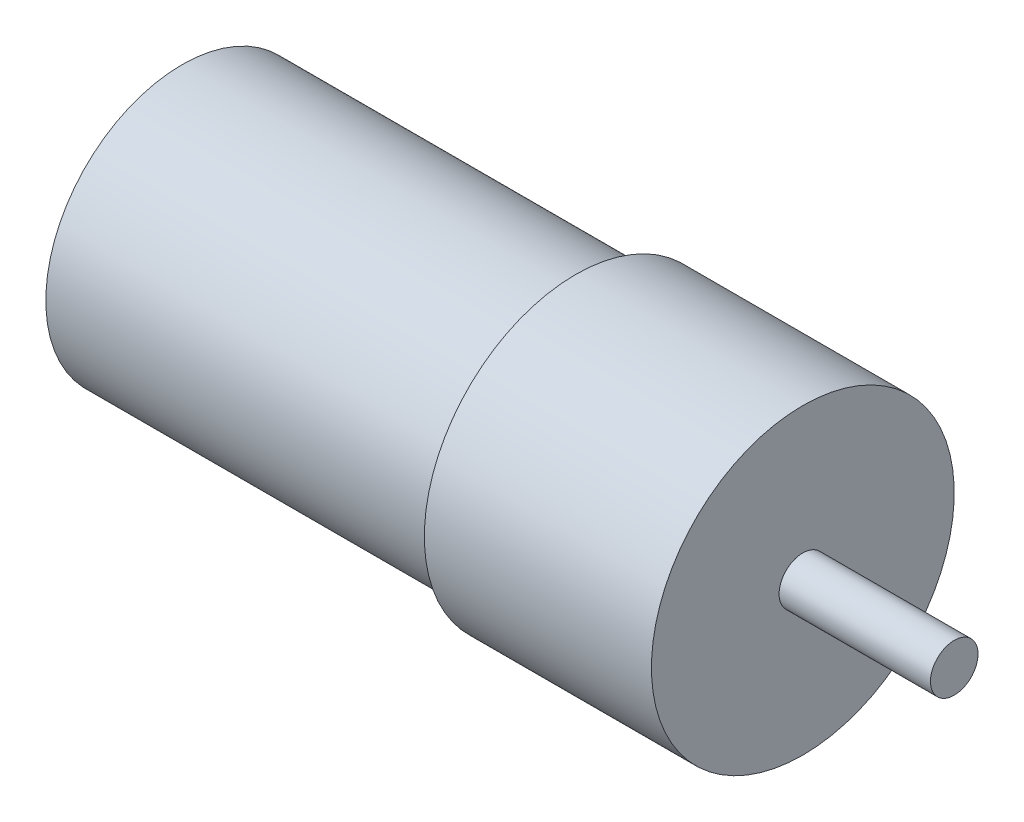
ISO-10303-21;
HEADER;
FILE_DESCRIPTION(('STEP AP214'),'2;1');
FILE_NAME('part.step','',(''),(''),'','','');
FILE_SCHEMA(('AUTOMOTIVE_DESIGN { 1 0 10303 214 1 1 1 1 }'));
ENDSEC;
DATA;
#1=APPLICATION_CONTEXT('core data for automotive mechanical design processes');
#2=APPLICATION_PROTOCOL_DEFINITION('international standard','automotive_design',2000,#1);
#3=PRODUCT_CONTEXT('',#1,'mechanical');
#4=PRODUCT('Part','Part','',(#3));
#5=PRODUCT_RELATED_PRODUCT_CATEGORY('part','',(#4));
#6=PRODUCT_DEFINITION_FORMATION('','',#4);
#7=PRODUCT_DEFINITION_CONTEXT('part definition',#1,'design');
#8=PRODUCT_DEFINITION('design','',#6,#7);
#9=PRODUCT_DEFINITION_SHAPE('','',#8);
#10=(LENGTH_UNIT() NAMED_UNIT(*) SI_UNIT(.MILLI.,.METRE.));
#11=(NAMED_UNIT(*) PLANE_ANGLE_UNIT() SI_UNIT($,.RADIAN.));
#12=(NAMED_UNIT(*) SI_UNIT($,.STERADIAN.) SOLID_ANGLE_UNIT());
#13=UNCERTAINTY_MEASURE_WITH_UNIT(LENGTH_MEASURE(1.E-05),#10,'distance_accuracy_value','');
#14=(GEOMETRIC_REPRESENTATION_CONTEXT(3) GLOBAL_UNCERTAINTY_ASSIGNED_CONTEXT((#13)) GLOBAL_UNIT_ASSIGNED_CONTEXT((#10,
#11,#12)) REPRESENTATION_CONTEXT('',''));
#15=CARTESIAN_POINT('',(0.,0.,0.));
#16=DIRECTION('',(0.,0.,1.));
#17=DIRECTION('',(1.,0.,0.));
#18=AXIS2_PLACEMENT_3D('',#15,#16,#17);
#19=CARTESIAN_POINT('',(0.,0.,0.));
#20=DIRECTION('',(-1.,0.,0.));
#21=DIRECTION('',(0.,-1.,0.));
#22=AXIS2_PLACEMENT_3D('',#19,#20,#21);
#23=PLANE('',#22);
#24=CARTESIAN_POINT('',(0.,0.,0.));
#25=DIRECTION('',(-1.,0.,0.));
#26=DIRECTION('',(0.,-1.,0.));
#27=AXIS2_PLACEMENT_3D('',#24,#25,#26);
#28=CIRCLE('',#27,1.9939);
#29=CARTESIAN_POINT('',(0.,-1.9939,0.));
#30=VERTEX_POINT('',#29);
#31=EDGE_CURVE('E12',#30,#30,#28,.T.);
#32=ORIENTED_EDGE('',*,*,#31,.F.);
#33=EDGE_LOOP('',(#32));
#34=FACE_BOUND('',#33,.T.);
#35=ADVANCED_FACE('F40',(#34),#23,.F.);
#36=CARTESIAN_POINT('',(-64.77,0.,0.));
#37=DIRECTION('',(-1.,0.,0.));
#38=DIRECTION('',(0.,-1.,0.));
#39=AXIS2_PLACEMENT_3D('',#36,#37,#38);
#40=CYLINDRICAL_SURFACE('',#39,1.9939);
#41=CARTESIAN_POINT('',(-12.7,0.,0.));
#42=DIRECTION('',(-1.,0.,0.));
#43=DIRECTION('',(0.,-1.,0.));
#44=AXIS2_PLACEMENT_3D('',#41,#42,#43);
#45=CIRCLE('',#44,1.9939);
#46=CARTESIAN_POINT('',(-12.7,-1.99390000000001,0.));
#47=VERTEX_POINT('',#46);
#48=EDGE_CURVE('E46',#47,#47,#45,.T.);
#49=ORIENTED_EDGE('',*,*,#48,.F.);
#50=EDGE_LOOP('',(#49));
#51=FACE_BOUND('',#50,.T.);
#52=ORIENTED_EDGE('',*,*,#31,.T.);
#53=EDGE_LOOP('',(#52));
#54=FACE_BOUND('',#53,.T.);
#55=ADVANCED_FACE('F88',(#51,#54),#40,.T.);
#56=CARTESIAN_POINT('',(-12.7,1.9939,0.));
#57=DIRECTION('',(-1.,0.,0.));
#58=DIRECTION('',(0.,-1.,0.));
#59=AXIS2_PLACEMENT_3D('',#56,#57,#58);
#60=PLANE('',#59);
#61=CARTESIAN_POINT('',(-12.7,0.,0.));
#62=DIRECTION('',(-1.,0.,0.));
#63=DIRECTION('',(0.,-1.,0.));
#64=AXIS2_PLACEMENT_3D('',#61,#62,#63);
#65=CIRCLE('',#64,12.7);
#66=CARTESIAN_POINT('',(-12.7,-12.7,0.));
#67=VERTEX_POINT('',#66);
#68=EDGE_CURVE('E50',#67,#67,#65,.T.);
#69=ORIENTED_EDGE('',*,*,#68,.F.);
#70=EDGE_LOOP('',(#69));
#71=FACE_BOUND('',#70,.T.);
#72=ORIENTED_EDGE('',*,*,#48,.T.);
#73=EDGE_LOOP('',(#72));
#74=FACE_BOUND('',#73,.T.);
#75=ADVANCED_FACE('F83',(#71,#74),#60,.F.);
#76=CARTESIAN_POINT('',(-64.77,0.,0.));
#77=DIRECTION('',(-1.,0.,0.));
#78=DIRECTION('',(0.,-1.,0.));
#79=AXIS2_PLACEMENT_3D('',#76,#77,#78);
#80=CYLINDRICAL_SURFACE('',#79,12.7);
#81=CARTESIAN_POINT('',(-31.75,0.,0.));
#82=DIRECTION('',(-1.,0.,0.));
#83=DIRECTION('',(0.,-1.,0.));
#84=AXIS2_PLACEMENT_3D('',#81,#82,#83);
#85=CIRCLE('',#84,12.7);
#86=CARTESIAN_POINT('',(-31.75,-12.7,0.));
#87=VERTEX_POINT('',#86);
#88=EDGE_CURVE('E54',#87,#87,#85,.T.);
#89=ORIENTED_EDGE('',*,*,#88,.F.);
#90=EDGE_LOOP('',(#89));
#91=FACE_BOUND('',#90,.T.);
#92=ORIENTED_EDGE('',*,*,#68,.T.);
#93=EDGE_LOOP('',(#92));
#94=FACE_BOUND('',#93,.T.);
#95=ADVANCED_FACE('F77',(#91,#94),#80,.T.);
#96=CARTESIAN_POINT('',(-31.75,12.7,0.));
#97=DIRECTION('',(1.,0.,0.));
#98=DIRECTION('',(0.,1.,0.));
#99=AXIS2_PLACEMENT_3D('',#96,#97,#98);
#100=PLANE('',#99);
#101=CARTESIAN_POINT('',(-31.75,0.,0.));
#102=DIRECTION('',(-1.,0.,0.));
#103=DIRECTION('',(0.,-1.,0.));
#104=AXIS2_PLACEMENT_3D('',#101,#102,#103);
#105=CIRCLE('',#104,11.43);
#106=CARTESIAN_POINT('',(-31.75,-11.43,0.));
#107=VERTEX_POINT('',#106);
#108=EDGE_CURVE('E59',#107,#107,#105,.T.);
#109=ORIENTED_EDGE('',*,*,#108,.F.);
#110=EDGE_LOOP('',(#109));
#111=FACE_BOUND('',#110,.T.);
#112=ORIENTED_EDGE('',*,*,#88,.T.);
#113=EDGE_LOOP('',(#112));
#114=FACE_BOUND('',#113,.T.);
#115=ADVANCED_FACE('F71',(#111,#114),#100,.F.);
#116=CARTESIAN_POINT('',(-64.77,0.,0.));
#117=DIRECTION('',(-1.,0.,0.));
#118=DIRECTION('',(0.,-1.,0.));
#119=AXIS2_PLACEMENT_3D('',#116,#117,#118);
#120=CYLINDRICAL_SURFACE('',#119,11.43);
#121=CARTESIAN_POINT('',(-64.77,0.,0.));
#122=DIRECTION('',(-1.,0.,0.));
#123=DIRECTION('',(0.,-1.,0.));
#124=AXIS2_PLACEMENT_3D('',#121,#122,#123);
#125=CIRCLE('',#124,11.43);
#126=CARTESIAN_POINT('',(-64.77,-11.43,0.));
#127=VERTEX_POINT('',#126);
#128=EDGE_CURVE('E62',#127,#127,#125,.T.);
#129=ORIENTED_EDGE('',*,*,#128,.F.);
#130=EDGE_LOOP('',(#129));
#131=FACE_BOUND('',#130,.T.);
#132=ORIENTED_EDGE('',*,*,#108,.T.);
#133=EDGE_LOOP('',(#132));
#134=FACE_BOUND('',#133,.T.);
#135=ADVANCED_FACE('F68',(#131,#134),#120,.T.);
#136=CARTESIAN_POINT('',(-64.77,11.43,0.));
#137=DIRECTION('',(1.,0.,0.));
#138=DIRECTION('',(0.,1.,0.));
#139=AXIS2_PLACEMENT_3D('',#136,#137,#138);
#140=PLANE('',#139);
#141=ORIENTED_EDGE('',*,*,#128,.T.);
#142=EDGE_LOOP('',(#141));
#143=FACE_BOUND('',#142,.T.);
#144=ADVANCED_FACE('F66',(#143),#140,.F.);
#145=CLOSED_SHELL('',(#35,#55,#75,#95,#115,#135,#144));
#146=MANIFOLD_SOLID_BREP('B2',#145);
#147=ADVANCED_BREP_SHAPE_REPRESENTATION('',(#18,#146),#14);
#148=SHAPE_DEFINITION_REPRESENTATION(#9,#147);
ENDSEC;
END-ISO-10303-21;
